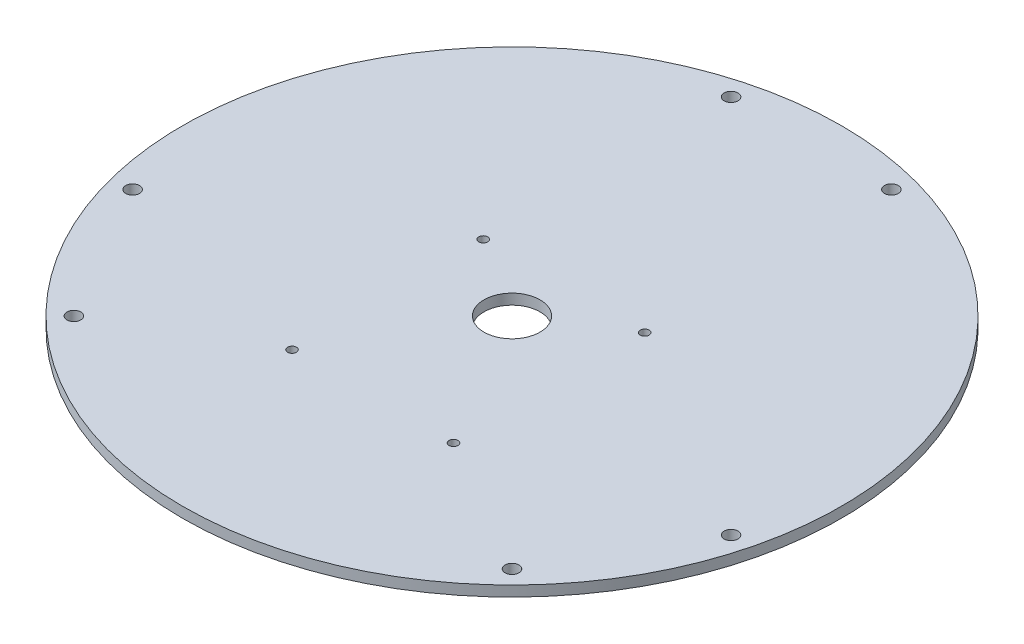
ISO-10303-21;
HEADER;
FILE_DESCRIPTION(('STEP AP214'),'2;1');
FILE_NAME('part.step','',(''),(''),'','','');
FILE_SCHEMA(('AUTOMOTIVE_DESIGN { 1 0 10303 214 1 1 1 1 }'));
ENDSEC;
DATA;
#1=APPLICATION_CONTEXT('core data for automotive mechanical design processes');
#2=APPLICATION_PROTOCOL_DEFINITION('international standard','automotive_design',2000,#1);
#3=PRODUCT_CONTEXT('',#1,'mechanical');
#4=PRODUCT('Part','Part','',(#3));
#5=PRODUCT_RELATED_PRODUCT_CATEGORY('part','',(#4));
#6=PRODUCT_DEFINITION_FORMATION('','',#4);
#7=PRODUCT_DEFINITION_CONTEXT('part definition',#1,'design');
#8=PRODUCT_DEFINITION('design','',#6,#7);
#9=PRODUCT_DEFINITION_SHAPE('','',#8);
#10=(LENGTH_UNIT() NAMED_UNIT(*) SI_UNIT(.MILLI.,.METRE.));
#11=(NAMED_UNIT(*) PLANE_ANGLE_UNIT() SI_UNIT($,.RADIAN.));
#12=(NAMED_UNIT(*) SI_UNIT($,.STERADIAN.) SOLID_ANGLE_UNIT());
#13=UNCERTAINTY_MEASURE_WITH_UNIT(LENGTH_MEASURE(1.E-05),#10,'distance_accuracy_value','');
#14=(GEOMETRIC_REPRESENTATION_CONTEXT(3) GLOBAL_UNCERTAINTY_ASSIGNED_CONTEXT((#13)) GLOBAL_UNIT_ASSIGNED_CONTEXT((#10,
#11,#12)) REPRESENTATION_CONTEXT('',''));
#15=CARTESIAN_POINT('',(0.,0.,0.));
#16=DIRECTION('',(0.,0.,1.));
#17=DIRECTION('',(1.,0.,0.));
#18=AXIS2_PLACEMENT_3D('',#15,#16,#17);
#19=CARTESIAN_POINT('',(0.,3.175,0.));
#20=DIRECTION('',(0.,1.,0.));
#21=DIRECTION('',(0.,0.,1.));
#22=AXIS2_PLACEMENT_3D('',#19,#20,#21);
#23=PLANE('',#22);
#24=CARTESIAN_POINT('',(-24.5,3.175,-15.75));
#25=DIRECTION('',(0.,1.,0.));
#26=DIRECTION('',(0.,0.,1.));
#27=AXIS2_PLACEMENT_3D('',#24,#25,#26);
#28=CIRCLE('',#27,1.35000000000001);
#29=CARTESIAN_POINT('',(-24.5,3.175,-14.4));
#30=VERTEX_POINT('',#29);
#31=EDGE_CURVE('E95',#30,#30,#28,.T.);
#32=ORIENTED_EDGE('',*,*,#31,.F.);
#33=EDGE_LOOP('',(#32));
#34=FACE_BOUND('',#33,.T.);
#35=CARTESIAN_POINT('',(24.5,3.175,42.25));
#36=DIRECTION('',(0.,1.,0.));
#37=DIRECTION('',(0.,0.,1.));
#38=AXIS2_PLACEMENT_3D('',#35,#36,#37);
#39=CIRCLE('',#38,1.35);
#40=CARTESIAN_POINT('',(24.5,3.175,43.6));
#41=VERTEX_POINT('',#40);
#42=EDGE_CURVE('E83',#41,#41,#39,.T.);
#43=ORIENTED_EDGE('',*,*,#42,.F.);
#44=EDGE_LOOP('',(#43));
#45=FACE_BOUND('',#44,.T.);
#46=CARTESIAN_POINT('',(-66.4680374315365,3.175,66.4680374315344));
#47=DIRECTION('',(0.,1.,0.));
#48=DIRECTION('',(0.,0.,-1.));
#49=AXIS2_PLACEMENT_3D('',#46,#47,#48);
#50=CIRCLE('',#49,2.10000000000002);
#51=CARTESIAN_POINT('',(-66.4680374315365,3.175,64.3680374315344));
#52=VERTEX_POINT('',#51);
#53=EDGE_CURVE('E71',#52,#52,#50,.T.);
#54=ORIENTED_EDGE('',*,*,#53,.F.);
#55=EDGE_LOOP('',(#54));
#56=FACE_BOUND('',#55,.T.);
#57=CARTESIAN_POINT('',(90.7970276711722,3.175,24.328990239638));
#58=DIRECTION('',(0.,1.,0.));
#59=DIRECTION('',(0.,0.,-1.));
#60=AXIS2_PLACEMENT_3D('',#57,#58,#59);
#61=CIRCLE('',#60,2.09999999999999);
#62=CARTESIAN_POINT('',(90.7970276711722,3.175,22.228990239638));
#63=VERTEX_POINT('',#62);
#64=EDGE_CURVE('E59',#63,#63,#61,.T.);
#65=ORIENTED_EDGE('',*,*,#64,.F.);
#66=EDGE_LOOP('',(#65));
#67=FACE_BOUND('',#66,.T.);
#68=CARTESIAN_POINT('',(-24.3289902396363,3.175,-90.7970276711726));
#69=DIRECTION('',(0.,1.,0.));
#70=DIRECTION('',(0.,0.,-1.));
#71=AXIS2_PLACEMENT_3D('',#68,#69,#70);
#72=CIRCLE('',#71,2.1);
#73=CARTESIAN_POINT('',(-24.3289902396363,3.175,-92.8970276711726));
#74=VERTEX_POINT('',#73);
#75=EDGE_CURVE('E47',#74,#74,#72,.T.);
#76=ORIENTED_EDGE('',*,*,#75,.F.);
#77=EDGE_LOOP('',(#76));
#78=FACE_BOUND('',#77,.T.);
#79=CARTESIAN_POINT('',(0.,3.175,0.));
#80=DIRECTION('',(0.,1.,0.));
#81=DIRECTION('',(0.,0.,1.));
#82=AXIS2_PLACEMENT_3D('',#79,#80,#81);
#83=CIRCLE('',#82,100.);
#84=CARTESIAN_POINT('',(0.,3.175,100.));
#85=VERTEX_POINT('',#84);
#86=EDGE_CURVE('E10',#85,#85,#83,.T.);
#87=ORIENTED_EDGE('',*,*,#86,.T.);
#88=EDGE_LOOP('',(#87));
#89=FACE_BOUND('',#88,.T.);
#90=CARTESIAN_POINT('',(24.3289902396363,3.175,-90.7970276711726));
#91=DIRECTION('',(0.,1.,0.));
#92=DIRECTION('',(0.,0.,1.));
#93=AXIS2_PLACEMENT_3D('',#90,#91,#92);
#94=CIRCLE('',#93,2.1);
#95=CARTESIAN_POINT('',(24.3289902396363,3.175,-88.6970276711726));
#96=VERTEX_POINT('',#95);
#97=EDGE_CURVE('E42',#96,#96,#94,.T.);
#98=ORIENTED_EDGE('',*,*,#97,.F.);
#99=EDGE_LOOP('',(#98));
#100=FACE_BOUND('',#99,.T.);
#101=CARTESIAN_POINT('',(66.4680374315356,3.175,66.4680374315354));
#102=DIRECTION('',(0.,1.,0.));
#103=DIRECTION('',(0.,0.,1.));
#104=AXIS2_PLACEMENT_3D('',#101,#102,#103);
#105=CIRCLE('',#104,2.09999999999999);
#106=CARTESIAN_POINT('',(66.4680374315356,3.175,68.5680374315354));
#107=VERTEX_POINT('',#106);
#108=EDGE_CURVE('E53',#107,#107,#105,.T.);
#109=ORIENTED_EDGE('',*,*,#108,.F.);
#110=EDGE_LOOP('',(#109));
#111=FACE_BOUND('',#110,.T.);
#112=CARTESIAN_POINT('',(-90.7970276711725,3.175,24.3289902396367));
#113=DIRECTION('',(0.,1.,0.));
#114=DIRECTION('',(0.,0.,1.));
#115=AXIS2_PLACEMENT_3D('',#112,#113,#114);
#116=CIRCLE('',#115,2.10000000000001);
#117=CARTESIAN_POINT('',(-90.7970276711725,3.175,26.4289902396367));
#118=VERTEX_POINT('',#117);
#119=EDGE_CURVE('E65',#118,#118,#116,.T.);
#120=ORIENTED_EDGE('',*,*,#119,.F.);
#121=EDGE_LOOP('',(#120));
#122=FACE_BOUND('',#121,.T.);
#123=CARTESIAN_POINT('',(-24.5,3.175,42.25));
#124=DIRECTION('',(0.,1.,0.));
#125=DIRECTION('',(0.,0.,1.));
#126=AXIS2_PLACEMENT_3D('',#123,#124,#125);
#127=CIRCLE('',#126,1.35);
#128=CARTESIAN_POINT('',(-24.5,3.175,43.6));
#129=VERTEX_POINT('',#128);
#130=EDGE_CURVE('E77',#129,#129,#127,.T.);
#131=ORIENTED_EDGE('',*,*,#130,.F.);
#132=EDGE_LOOP('',(#131));
#133=FACE_BOUND('',#132,.T.);
#134=CARTESIAN_POINT('',(24.5,3.175,-15.75));
#135=DIRECTION('',(0.,1.,0.));
#136=DIRECTION('',(0.,0.,1.));
#137=AXIS2_PLACEMENT_3D('',#134,#135,#136);
#138=CIRCLE('',#137,1.35000000000001);
#139=CARTESIAN_POINT('',(24.5,3.175,-14.4));
#140=VERTEX_POINT('',#139);
#141=EDGE_CURVE('E89',#140,#140,#138,.T.);
#142=ORIENTED_EDGE('',*,*,#141,.F.);
#143=EDGE_LOOP('',(#142));
#144=FACE_BOUND('',#143,.T.);
#145=CARTESIAN_POINT('',(0.,3.175,0.));
#146=DIRECTION('',(0.,1.,0.));
#147=DIRECTION('',(0.,0.,1.));
#148=AXIS2_PLACEMENT_3D('',#145,#146,#147);
#149=CIRCLE('',#148,8.5);
#150=CARTESIAN_POINT('',(0.,3.175,8.5));
#151=VERTEX_POINT('',#150);
#152=EDGE_CURVE('E101',#151,#151,#149,.T.);
#153=ORIENTED_EDGE('',*,*,#152,.F.);
#154=EDGE_LOOP('',(#153));
#155=FACE_BOUND('',#154,.T.);
#156=ADVANCED_FACE('F31',(#34,#45,#56,#67,#78,#89,#100,#111,#122,#133,#144,#155),#23,.T.);
#157=CARTESIAN_POINT('',(0.,0.,0.));
#158=DIRECTION('',(0.,1.,0.));
#159=DIRECTION('',(0.,0.,1.));
#160=AXIS2_PLACEMENT_3D('',#157,#158,#159);
#161=PLANE('',#160);
#162=CARTESIAN_POINT('',(0.,0.,0.));
#163=DIRECTION('',(0.,1.,0.));
#164=DIRECTION('',(0.,0.,1.));
#165=AXIS2_PLACEMENT_3D('',#162,#163,#164);
#166=CIRCLE('',#165,100.);
#167=CARTESIAN_POINT('',(0.,0.,100.));
#168=VERTEX_POINT('',#167);
#169=EDGE_CURVE('E35',#168,#168,#166,.T.);
#170=ORIENTED_EDGE('',*,*,#169,.F.);
#171=EDGE_LOOP('',(#170));
#172=FACE_BOUND('',#171,.T.);
#173=CARTESIAN_POINT('',(24.3289902396363,0.,-90.7970276711726));
#174=DIRECTION('',(0.,1.,0.));
#175=DIRECTION('',(0.,0.,1.));
#176=AXIS2_PLACEMENT_3D('',#173,#174,#175);
#177=CIRCLE('',#176,2.1);
#178=CARTESIAN_POINT('',(24.3289902396363,0.,-88.6970276711726));
#179=VERTEX_POINT('',#178);
#180=EDGE_CURVE('E44',#179,#179,#177,.T.);
#181=ORIENTED_EDGE('',*,*,#180,.T.);
#182=EDGE_LOOP('',(#181));
#183=FACE_BOUND('',#182,.T.);
#184=CARTESIAN_POINT('',(-24.3289902396363,0.,-90.7970276711726));
#185=DIRECTION('',(0.,1.,0.));
#186=DIRECTION('',(0.,0.,-1.));
#187=AXIS2_PLACEMENT_3D('',#184,#185,#186);
#188=CIRCLE('',#187,2.1);
#189=CARTESIAN_POINT('',(-24.3289902396363,0.,-92.8970276711726));
#190=VERTEX_POINT('',#189);
#191=EDGE_CURVE('E50',#190,#190,#188,.T.);
#192=ORIENTED_EDGE('',*,*,#191,.T.);
#193=EDGE_LOOP('',(#192));
#194=FACE_BOUND('',#193,.T.);
#195=CARTESIAN_POINT('',(66.4680374315356,0.,66.4680374315354));
#196=DIRECTION('',(0.,1.,0.));
#197=DIRECTION('',(0.,0.,1.));
#198=AXIS2_PLACEMENT_3D('',#195,#196,#197);
#199=CIRCLE('',#198,2.09999999999999);
#200=CARTESIAN_POINT('',(66.4680374315356,0.,68.5680374315354));
#201=VERTEX_POINT('',#200);
#202=EDGE_CURVE('E56',#201,#201,#199,.T.);
#203=ORIENTED_EDGE('',*,*,#202,.T.);
#204=EDGE_LOOP('',(#203));
#205=FACE_BOUND('',#204,.T.);
#206=CARTESIAN_POINT('',(90.7970276711722,0.,24.328990239638));
#207=DIRECTION('',(0.,1.,0.));
#208=DIRECTION('',(0.,0.,-1.));
#209=AXIS2_PLACEMENT_3D('',#206,#207,#208);
#210=CIRCLE('',#209,2.09999999999999);
#211=CARTESIAN_POINT('',(90.7970276711722,0.,22.228990239638));
#212=VERTEX_POINT('',#211);
#213=EDGE_CURVE('E62',#212,#212,#210,.T.);
#214=ORIENTED_EDGE('',*,*,#213,.T.);
#215=EDGE_LOOP('',(#214));
#216=FACE_BOUND('',#215,.T.);
#217=CARTESIAN_POINT('',(-90.7970276711725,0.,24.3289902396367));
#218=DIRECTION('',(0.,1.,0.));
#219=DIRECTION('',(0.,0.,1.));
#220=AXIS2_PLACEMENT_3D('',#217,#218,#219);
#221=CIRCLE('',#220,2.10000000000001);
#222=CARTESIAN_POINT('',(-90.7970276711725,0.,26.4289902396367));
#223=VERTEX_POINT('',#222);
#224=EDGE_CURVE('E68',#223,#223,#221,.T.);
#225=ORIENTED_EDGE('',*,*,#224,.T.);
#226=EDGE_LOOP('',(#225));
#227=FACE_BOUND('',#226,.T.);
#228=CARTESIAN_POINT('',(-66.4680374315365,0.,66.4680374315344));
#229=DIRECTION('',(0.,1.,0.));
#230=DIRECTION('',(0.,0.,-1.));
#231=AXIS2_PLACEMENT_3D('',#228,#229,#230);
#232=CIRCLE('',#231,2.10000000000002);
#233=CARTESIAN_POINT('',(-66.4680374315365,0.,64.3680374315344));
#234=VERTEX_POINT('',#233);
#235=EDGE_CURVE('E74',#234,#234,#232,.T.);
#236=ORIENTED_EDGE('',*,*,#235,.T.);
#237=EDGE_LOOP('',(#236));
#238=FACE_BOUND('',#237,.T.);
#239=CARTESIAN_POINT('',(-24.5,0.,42.25));
#240=DIRECTION('',(0.,1.,0.));
#241=DIRECTION('',(0.,0.,1.));
#242=AXIS2_PLACEMENT_3D('',#239,#240,#241);
#243=CIRCLE('',#242,1.35);
#244=CARTESIAN_POINT('',(-24.5,0.,43.6));
#245=VERTEX_POINT('',#244);
#246=EDGE_CURVE('E80',#245,#245,#243,.T.);
#247=ORIENTED_EDGE('',*,*,#246,.T.);
#248=EDGE_LOOP('',(#247));
#249=FACE_BOUND('',#248,.T.);
#250=CARTESIAN_POINT('',(24.5,0.,42.25));
#251=DIRECTION('',(0.,1.,0.));
#252=DIRECTION('',(0.,0.,1.));
#253=AXIS2_PLACEMENT_3D('',#250,#251,#252);
#254=CIRCLE('',#253,1.35);
#255=CARTESIAN_POINT('',(24.5,0.,43.6));
#256=VERTEX_POINT('',#255);
#257=EDGE_CURVE('E86',#256,#256,#254,.T.);
#258=ORIENTED_EDGE('',*,*,#257,.T.);
#259=EDGE_LOOP('',(#258));
#260=FACE_BOUND('',#259,.T.);
#261=CARTESIAN_POINT('',(24.5,0.,-15.75));
#262=DIRECTION('',(0.,1.,0.));
#263=DIRECTION('',(0.,0.,1.));
#264=AXIS2_PLACEMENT_3D('',#261,#262,#263);
#265=CIRCLE('',#264,1.35000000000001);
#266=CARTESIAN_POINT('',(24.5,0.,-14.4));
#267=VERTEX_POINT('',#266);
#268=EDGE_CURVE('E92',#267,#267,#265,.T.);
#269=ORIENTED_EDGE('',*,*,#268,.T.);
#270=EDGE_LOOP('',(#269));
#271=FACE_BOUND('',#270,.T.);
#272=CARTESIAN_POINT('',(-24.5,0.,-15.75));
#273=DIRECTION('',(0.,1.,0.));
#274=DIRECTION('',(0.,0.,1.));
#275=AXIS2_PLACEMENT_3D('',#272,#273,#274);
#276=CIRCLE('',#275,1.35000000000001);
#277=CARTESIAN_POINT('',(-24.5,0.,-14.4));
#278=VERTEX_POINT('',#277);
#279=EDGE_CURVE('E98',#278,#278,#276,.T.);
#280=ORIENTED_EDGE('',*,*,#279,.T.);
#281=EDGE_LOOP('',(#280));
#282=FACE_BOUND('',#281,.T.);
#283=CARTESIAN_POINT('',(0.,0.,0.));
#284=DIRECTION('',(0.,1.,0.));
#285=DIRECTION('',(0.,0.,1.));
#286=AXIS2_PLACEMENT_3D('',#283,#284,#285);
#287=CIRCLE('',#286,8.5);
#288=CARTESIAN_POINT('',(0.,0.,8.5));
#289=VERTEX_POINT('',#288);
#290=EDGE_CURVE('E104',#289,#289,#287,.T.);
#291=ORIENTED_EDGE('',*,*,#290,.T.);
#292=EDGE_LOOP('',(#291));
#293=FACE_BOUND('',#292,.T.);
#294=ADVANCED_FACE('F114',(#172,#183,#194,#205,#216,#227,#238,#249,#260,#271,#282,#293),#161,.F.);
#295=CARTESIAN_POINT('',(0.,3.175,0.));
#296=DIRECTION('',(0.,-1.,0.));
#297=DIRECTION('',(0.,0.,-1.));
#298=AXIS2_PLACEMENT_3D('',#295,#296,#297);
#299=CYLINDRICAL_SURFACE('',#298,100.);
#300=ORIENTED_EDGE('',*,*,#86,.F.);
#301=EDGE_LOOP('',(#300));
#302=FACE_BOUND('',#301,.T.);
#303=ORIENTED_EDGE('',*,*,#169,.T.);
#304=EDGE_LOOP('',(#303));
#305=FACE_BOUND('',#304,.T.);
#306=ADVANCED_FACE('F33',(#302,#305),#299,.T.);
#307=CARTESIAN_POINT('',(24.3289902396363,3.175,-90.7970276711726));
#308=DIRECTION('',(0.,-1.,0.));
#309=DIRECTION('',(0.,0.,-1.));
#310=AXIS2_PLACEMENT_3D('',#307,#308,#309);
#311=CYLINDRICAL_SURFACE('',#310,2.1);
#312=ORIENTED_EDGE('',*,*,#97,.T.);
#313=EDGE_LOOP('',(#312));
#314=FACE_BOUND('',#313,.T.);
#315=ORIENTED_EDGE('',*,*,#180,.F.);
#316=EDGE_LOOP('',(#315));
#317=FACE_BOUND('',#316,.T.);
#318=ADVANCED_FACE('F124',(#314,#317),#311,.F.);
#319=CARTESIAN_POINT('',(-24.3289902396363,3.175,-90.7970276711726));
#320=DIRECTION('',(0.,-1.,0.));
#321=DIRECTION('',(0.,0.,-1.));
#322=AXIS2_PLACEMENT_3D('',#319,#320,#321);
#323=CYLINDRICAL_SURFACE('',#322,2.1);
#324=ORIENTED_EDGE('',*,*,#75,.T.);
#325=EDGE_LOOP('',(#324));
#326=FACE_BOUND('',#325,.T.);
#327=ORIENTED_EDGE('',*,*,#191,.F.);
#328=EDGE_LOOP('',(#327));
#329=FACE_BOUND('',#328,.T.);
#330=ADVANCED_FACE('F127',(#326,#329),#323,.F.);
#331=CARTESIAN_POINT('',(66.4680374315356,3.175,66.4680374315354));
#332=DIRECTION('',(0.,-1.,0.));
#333=DIRECTION('',(0.,0.,-1.));
#334=AXIS2_PLACEMENT_3D('',#331,#332,#333);
#335=CYLINDRICAL_SURFACE('',#334,2.09999999999999);
#336=ORIENTED_EDGE('',*,*,#108,.T.);
#337=EDGE_LOOP('',(#336));
#338=FACE_BOUND('',#337,.T.);
#339=ORIENTED_EDGE('',*,*,#202,.F.);
#340=EDGE_LOOP('',(#339));
#341=FACE_BOUND('',#340,.T.);
#342=ADVANCED_FACE('F131',(#338,#341),#335,.F.);
#343=CARTESIAN_POINT('',(90.7970276711722,3.175,24.328990239638));
#344=DIRECTION('',(0.,-1.,0.));
#345=DIRECTION('',(0.,0.,-1.));
#346=AXIS2_PLACEMENT_3D('',#343,#344,#345);
#347=CYLINDRICAL_SURFACE('',#346,2.09999999999999);
#348=ORIENTED_EDGE('',*,*,#64,.T.);
#349=EDGE_LOOP('',(#348));
#350=FACE_BOUND('',#349,.T.);
#351=ORIENTED_EDGE('',*,*,#213,.F.);
#352=EDGE_LOOP('',(#351));
#353=FACE_BOUND('',#352,.T.);
#354=ADVANCED_FACE('F135',(#350,#353),#347,.F.);
#355=CARTESIAN_POINT('',(-90.7970276711725,3.175,24.3289902396367));
#356=DIRECTION('',(0.,-1.,0.));
#357=DIRECTION('',(0.,0.,-1.));
#358=AXIS2_PLACEMENT_3D('',#355,#356,#357);
#359=CYLINDRICAL_SURFACE('',#358,2.10000000000001);
#360=ORIENTED_EDGE('',*,*,#119,.T.);
#361=EDGE_LOOP('',(#360));
#362=FACE_BOUND('',#361,.T.);
#363=ORIENTED_EDGE('',*,*,#224,.F.);
#364=EDGE_LOOP('',(#363));
#365=FACE_BOUND('',#364,.T.);
#366=ADVANCED_FACE('F139',(#362,#365),#359,.F.);
#367=CARTESIAN_POINT('',(-66.4680374315365,3.175,66.4680374315344));
#368=DIRECTION('',(0.,-1.,0.));
#369=DIRECTION('',(0.,0.,-1.));
#370=AXIS2_PLACEMENT_3D('',#367,#368,#369);
#371=CYLINDRICAL_SURFACE('',#370,2.10000000000002);
#372=ORIENTED_EDGE('',*,*,#53,.T.);
#373=EDGE_LOOP('',(#372));
#374=FACE_BOUND('',#373,.T.);
#375=ORIENTED_EDGE('',*,*,#235,.F.);
#376=EDGE_LOOP('',(#375));
#377=FACE_BOUND('',#376,.T.);
#378=ADVANCED_FACE('F143',(#374,#377),#371,.F.);
#379=CARTESIAN_POINT('',(-24.5,3.175,42.25));
#380=DIRECTION('',(0.,-1.,0.));
#381=DIRECTION('',(0.,0.,-1.));
#382=AXIS2_PLACEMENT_3D('',#379,#380,#381);
#383=CYLINDRICAL_SURFACE('',#382,1.35);
#384=ORIENTED_EDGE('',*,*,#130,.T.);
#385=EDGE_LOOP('',(#384));
#386=FACE_BOUND('',#385,.T.);
#387=ORIENTED_EDGE('',*,*,#246,.F.);
#388=EDGE_LOOP('',(#387));
#389=FACE_BOUND('',#388,.T.);
#390=ADVANCED_FACE('F147',(#386,#389),#383,.F.);
#391=CARTESIAN_POINT('',(24.5,3.175,42.25));
#392=DIRECTION('',(0.,-1.,0.));
#393=DIRECTION('',(0.,0.,-1.));
#394=AXIS2_PLACEMENT_3D('',#391,#392,#393);
#395=CYLINDRICAL_SURFACE('',#394,1.35);
#396=ORIENTED_EDGE('',*,*,#42,.T.);
#397=EDGE_LOOP('',(#396));
#398=FACE_BOUND('',#397,.T.);
#399=ORIENTED_EDGE('',*,*,#257,.F.);
#400=EDGE_LOOP('',(#399));
#401=FACE_BOUND('',#400,.T.);
#402=ADVANCED_FACE('F151',(#398,#401),#395,.F.);
#403=CARTESIAN_POINT('',(24.5,3.175,-15.75));
#404=DIRECTION('',(0.,-1.,0.));
#405=DIRECTION('',(0.,0.,-1.));
#406=AXIS2_PLACEMENT_3D('',#403,#404,#405);
#407=CYLINDRICAL_SURFACE('',#406,1.35000000000001);
#408=ORIENTED_EDGE('',*,*,#141,.T.);
#409=EDGE_LOOP('',(#408));
#410=FACE_BOUND('',#409,.T.);
#411=ORIENTED_EDGE('',*,*,#268,.F.);
#412=EDGE_LOOP('',(#411));
#413=FACE_BOUND('',#412,.T.);
#414=ADVANCED_FACE('F155',(#410,#413),#407,.F.);
#415=CARTESIAN_POINT('',(-24.5,3.175,-15.75));
#416=DIRECTION('',(0.,-1.,0.));
#417=DIRECTION('',(0.,0.,-1.));
#418=AXIS2_PLACEMENT_3D('',#415,#416,#417);
#419=CYLINDRICAL_SURFACE('',#418,1.35000000000001);
#420=ORIENTED_EDGE('',*,*,#31,.T.);
#421=EDGE_LOOP('',(#420));
#422=FACE_BOUND('',#421,.T.);
#423=ORIENTED_EDGE('',*,*,#279,.F.);
#424=EDGE_LOOP('',(#423));
#425=FACE_BOUND('',#424,.T.);
#426=ADVANCED_FACE('F159',(#422,#425),#419,.F.);
#427=CARTESIAN_POINT('',(0.,3.175,0.));
#428=DIRECTION('',(0.,-1.,0.));
#429=DIRECTION('',(0.,0.,-1.));
#430=AXIS2_PLACEMENT_3D('',#427,#428,#429);
#431=CYLINDRICAL_SURFACE('',#430,8.5);
#432=ORIENTED_EDGE('',*,*,#152,.T.);
#433=EDGE_LOOP('',(#432));
#434=FACE_BOUND('',#433,.T.);
#435=ORIENTED_EDGE('',*,*,#290,.F.);
#436=EDGE_LOOP('',(#435));
#437=FACE_BOUND('',#436,.T.);
#438=ADVANCED_FACE('F110',(#434,#437),#431,.F.);
#439=CLOSED_SHELL('',(#156,#294,#306,#318,#330,#342,#354,#366,#378,#390,#402,#414,#426,#438));
#440=MANIFOLD_SOLID_BREP('B2',#439);
#441=ADVANCED_BREP_SHAPE_REPRESENTATION('',(#18,#440),#14);
#442=SHAPE_DEFINITION_REPRESENTATION(#9,#441);
ENDSEC;
END-ISO-10303-21;
